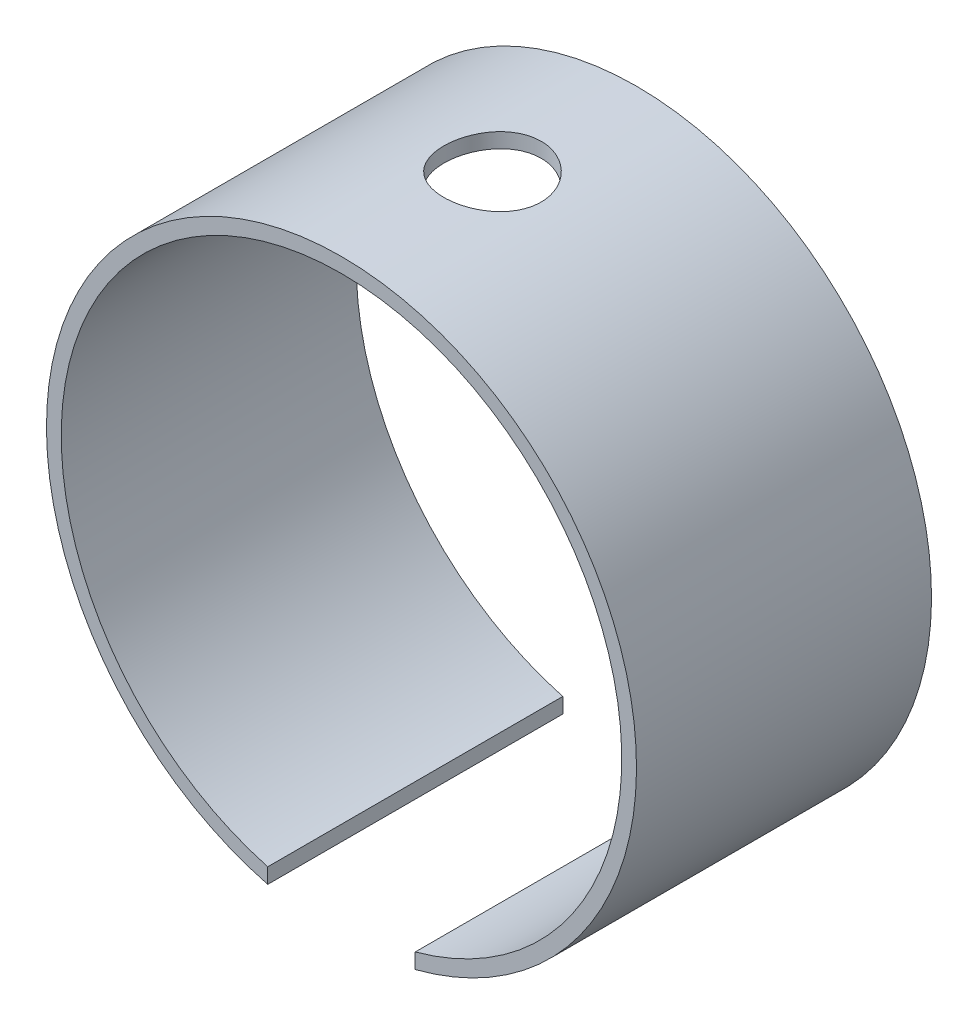
ISO-10303-21;
HEADER;
FILE_DESCRIPTION(('STEP AP214'),'2;1');
FILE_NAME('part.step','',(''),(''),'','','');
FILE_SCHEMA(('AUTOMOTIVE_DESIGN { 1 0 10303 214 1 1 1 1 }'));
ENDSEC;
DATA;
#1=APPLICATION_CONTEXT('core data for automotive mechanical design processes');
#2=APPLICATION_PROTOCOL_DEFINITION('international standard','automotive_design',2000,#1);
#3=PRODUCT_CONTEXT('',#1,'mechanical');
#4=PRODUCT('Part','Part','',(#3));
#5=PRODUCT_RELATED_PRODUCT_CATEGORY('part','',(#4));
#6=PRODUCT_DEFINITION_FORMATION('','',#4);
#7=PRODUCT_DEFINITION_CONTEXT('part definition',#1,'design');
#8=PRODUCT_DEFINITION('design','',#6,#7);
#9=PRODUCT_DEFINITION_SHAPE('','',#8);
#10=(LENGTH_UNIT() NAMED_UNIT(*) SI_UNIT(.MILLI.,.METRE.));
#11=(NAMED_UNIT(*) PLANE_ANGLE_UNIT() SI_UNIT($,.RADIAN.));
#12=(NAMED_UNIT(*) SI_UNIT($,.STERADIAN.) SOLID_ANGLE_UNIT());
#13=UNCERTAINTY_MEASURE_WITH_UNIT(LENGTH_MEASURE(1.E-05),#10,'distance_accuracy_value','');
#14=(GEOMETRIC_REPRESENTATION_CONTEXT(3) GLOBAL_UNCERTAINTY_ASSIGNED_CONTEXT((#13)) GLOBAL_UNIT_ASSIGNED_CONTEXT((#10,
#11,#12)) REPRESENTATION_CONTEXT('',''));
#15=CARTESIAN_POINT('',(0.,0.,0.));
#16=DIRECTION('',(0.,0.,1.));
#17=DIRECTION('',(1.,0.,0.));
#18=AXIS2_PLACEMENT_3D('',#15,#16,#17);
#19=CARTESIAN_POINT('',(0.,0.,10.));
#20=DIRECTION('',(0.,0.,-1.));
#21=DIRECTION('',(-1.,0.,0.));
#22=AXIS2_PLACEMENT_3D('',#19,#20,#21);
#23=CYLINDRICAL_SURFACE('',#22,10.);
#24=CARTESIAN_POINT('',(0.,10.,3.23240713275445));
#25=CARTESIAN_POINT('',(-0.0920114531057515,9.99999843258098,3.23241083373976));
#26=CARTESIAN_POINT('',(-0.184073454347173,9.9987168476551,3.24012959143987));
#27=CARTESIAN_POINT('',(-0.36561632253533,9.99372775496381,3.27078836789238));
#28=CARTESIAN_POINT('',(-0.45509472135177,9.99001800272159,3.29374246971325));
#29=CARTESIAN_POINT('',(-0.628817487751616,9.98058875631552,3.35416077169037));
#30=CARTESIAN_POINT('',(-0.713066038744486,9.974870893487,3.39161319631475));
#31=CARTESIAN_POINT('',(-0.874072236504043,9.96205444853337,3.47993438690307));
#32=CARTESIAN_POINT('',(-0.95083075765333,9.95495602786422,3.53080158425946));
#33=CARTESIAN_POINT('',(-1.09540879372213,9.9400912001718,3.64501590988737));
#34=CARTESIAN_POINT('',(-1.16314787882339,9.93231968689365,3.7084641963727));
#35=CARTESIAN_POINT('',(-1.28706950777735,9.91702374723339,3.84582190634768));
#36=CARTESIAN_POINT('',(-1.34325132909589,9.90949933632427,3.91973198339763));
#37=CARTESIAN_POINT('',(-1.44278500045253,9.89550007731641,4.07646647643113));
#38=CARTESIAN_POINT('',(-1.48605749570899,9.88903182722124,4.15934192709833));
#39=CARTESIAN_POINT('',(-1.55803674048924,9.87794796970923,4.33130975799094));
#40=CARTESIAN_POINT('',(-1.58674445381556,9.87333223970889,4.42040172640373));
#41=CARTESIAN_POINT('',(-1.6285261950301,9.86652679242373,4.60142171475544));
#42=CARTESIAN_POINT('',(-1.64173895927951,9.86431555933323,4.69331688843321));
#43=CARTESIAN_POINT('',(-1.65258585530687,9.86250435770823,4.87804449867788));
#44=CARTESIAN_POINT('',(-1.6502210677036,9.86290420804218,4.97087686978508));
#45=CARTESIAN_POINT('',(-1.63009303176278,9.86625034802632,5.15385440981116));
#46=CARTESIAN_POINT('',(-1.61248549472488,9.86917088684506,5.24401724678183));
#47=CARTESIAN_POINT('',(-1.5626160736781,9.87718903199042,5.42009120328785));
#48=CARTESIAN_POINT('',(-1.53035369619838,9.88228671162733,5.50600217954273));
#49=CARTESIAN_POINT('',(-1.45193210975571,9.89411264039674,5.67160066267887));
#50=CARTESIAN_POINT('',(-1.4057081060585,9.90084846298694,5.75125692199514));
#51=CARTESIAN_POINT('',(-1.30072141548377,9.9151864393107,5.90174145666221));
#52=CARTESIAN_POINT('',(-1.24195773629987,9.92278866158316,5.97256903266674));
#53=CARTESIAN_POINT('',(-1.11271072676603,9.93811607123993,6.10428711163713));
#54=CARTESIAN_POINT('',(-1.04209376928223,9.94584163094155,6.16504652738441));
#55=CARTESIAN_POINT('',(-0.891597059898566,9.96045987838133,6.27387315436072));
#56=CARTESIAN_POINT('',(-0.811717250503358,9.9673525609492,6.32194028680155));
#57=CARTESIAN_POINT('',(-0.644840083170754,9.97953794169528,6.40402928328877));
#58=CARTESIAN_POINT('',(-0.55783700315656,9.98482933722619,6.43803972039248));
#59=CARTESIAN_POINT('',(-0.379246930002471,9.99320544362233,6.49092904552979));
#60=CARTESIAN_POINT('',(-0.287660313260821,9.99629033536768,6.50980917389924));
#61=CARTESIAN_POINT('',(-0.103632983819161,9.99988156603306,6.53172459391562));
#62=CARTESIAN_POINT('',(-0.0112142564118353,10.0004171933872,6.53493986887599));
#63=CARTESIAN_POINT('',(0.172841505554682,9.99892971175882,6.52591393407419));
#64=CARTESIAN_POINT('',(0.264478569441164,9.99690669920295,6.51367330679398));
#65=CARTESIAN_POINT('',(0.44381495554177,9.99054737820398,6.47423272997735));
#66=CARTESIAN_POINT('',(0.531534371938302,9.98622483070291,6.4471217384461));
#67=CARTESIAN_POINT('',(0.701182959294593,9.97574921956607,6.37880474019938));
#68=CARTESIAN_POINT('',(0.78311181018899,9.96959605484327,6.33759795509277));
#69=CARTESIAN_POINT('',(0.939636398877253,9.95606928426946,6.24184581325547));
#70=CARTESIAN_POINT('',(1.01416235726447,9.94868555427358,6.18718784683735));
#71=CARTESIAN_POINT('',(1.15304841333209,9.93354765732487,6.06623998368566));
#72=CARTESIAN_POINT('',(1.21740778758216,9.92579346406182,5.99994925990016));
#73=CARTESIAN_POINT('',(1.33479962911472,9.91069407401676,5.85681102642616));
#74=CARTESIAN_POINT('',(1.38771058951944,9.90335382329475,5.77986326165564));
#75=CARTESIAN_POINT('',(1.47985547415617,9.89000528724128,5.61806608568699));
#76=CARTESIAN_POINT('',(1.51908982562647,9.88399696030451,5.53321692142254));
#77=CARTESIAN_POINT('',(1.58258535747086,9.87402953570153,5.3583676003513));
#78=CARTESIAN_POINT('',(1.60690737863649,9.87006212213643,5.26839003295778));
#79=CARTESIAN_POINT('',(1.64007952798876,9.86460473721112,5.08555582097389));
#80=CARTESIAN_POINT('',(1.64893097191819,9.86311455516768,4.99269942190629));
#81=CARTESIAN_POINT('',(1.65087457438795,9.86278931217107,4.80795649145264));
#82=CARTESIAN_POINT('',(1.64415796786954,9.86392203182987,4.71607197256234));
#83=CARTESIAN_POINT('',(1.61556925478547,9.86864441177183,4.53475938089058));
#84=CARTESIAN_POINT('',(1.59369719454886,9.87223406454433,4.44533130060086));
#85=CARTESIAN_POINT('',(1.53549112071357,9.88145370519205,4.27154189031904));
#86=CARTESIAN_POINT('',(1.49917324977366,9.88708141498759,4.18717502530348));
#87=CARTESIAN_POINT('',(1.41312606218935,9.8997453323177,4.02570086589413));
#88=CARTESIAN_POINT('',(1.36339610211421,9.90678160742252,3.94859392002672));
#89=CARTESIAN_POINT('',(1.25125259966706,9.92157214136343,3.80286163511676));
#90=CARTESIAN_POINT('',(1.18869826623127,9.92933379899765,3.73434537293488));
#91=CARTESIAN_POINT('',(1.05297867490409,9.94464125601211,3.60871653287769));
#92=CARTESIAN_POINT('',(0.979810970092672,9.95218700513286,3.55160659197421));
#93=CARTESIAN_POINT('',(0.824354696103047,9.96627143049841,3.45005971018097));
#94=CARTESIAN_POINT('',(0.742007852048188,9.97280295936929,3.40571098477642));
#95=CARTESIAN_POINT('',(0.570959586923796,9.98405342047581,3.33154377994814));
#96=CARTESIAN_POINT('',(0.482264623543764,9.98877416450827,3.30171076862921));
#97=CARTESIAN_POINT('',(0.327682758240929,9.99483601455804,3.26392779122761));
#98=CARTESIAN_POINT('',(0.2627330667111,9.99676220083327,3.25212638393995));
#99=CARTESIAN_POINT('',(0.131864227625941,9.99934474465587,3.23636479382134));
#100=CARTESIAN_POINT('',(0.065945096254669,10.0000011233775,3.23240448023866));
#101=CARTESIAN_POINT('',(0.,10.,3.23240713275445));
#102=B_SPLINE_CURVE_WITH_KNOTS('',3,(#24,#25,#26,#27,#28,#29,#30,#31,#32,#33,#34,#35,#36,#37,
#38,#39,#40,#41,#42,#43,#44,#45,#46,#47,#48,#49,#50,#51,#52,#53,#54,#55,#56,#57,#58,#59,#60,#61,
#62,#63,#64,#65,#66,#67,#68,#69,#70,#71,#72,#73,#74,#75,#76,#77,#78,#79,#80,#81,#82,#83,#84,#85,
#86,#87,#88,#89,#90,#91,#92,#93,#94,#95,#96,#97,#98,#99,#100,#101),.UNSPECIFIED.,.T.,.F.,(4,2,2,
2,2,2,2,2,2,2,2,2,2,2,2,2,2,2,2,2,2,2,2,2,2,2,2,2,2,2,2,2,2,2,2,2,2,2,4),(0.,0.275793319008919,
0.551841928312974,0.827666799870601,1.10345943314171,1.38156673144316,1.65969141110742,
1.93949209608634,2.21927426326045,2.49653175525207,2.7737700140227,3.04820914252878,
3.32265751287873,3.59839967320043,3.87416366201708,4.15327572401922,4.43238951858749,
4.71172976565334,4.99104711092802,5.26714751096619,5.54323750600191,5.81769359979006,
6.09216485190805,6.36901711215388,6.6458890636926,6.92556925596461,7.2052407106323,
7.48376340648035,7.76226241335699,8.03735855216248,8.31245385002405,8.58724259883662,
8.86204453269319,9.1400425875962,9.41810483731135,9.69804546871321,9.97770526783285,
10.1753710978728,10.3730336317699),.UNSPECIFIED.);
#103=CARTESIAN_POINT('',(0.,10.,3.23240713275445));
#104=VERTEX_POINT('',#103);
#105=EDGE_CURVE('E91',#104,#104,#102,.T.);
#106=ORIENTED_EDGE('',*,*,#105,.F.);
#107=EDGE_LOOP('',(#106));
#108=FACE_BOUND('',#107,.T.);
#109=CARTESIAN_POINT('',(0.,0.,10.));
#110=DIRECTION('',(0.,0.,1.));
#111=DIRECTION('',(1.,0.,0.));
#112=AXIS2_PLACEMENT_3D('',#109,#110,#111);
#113=CIRCLE('',#112,10.);
#114=CARTESIAN_POINT('',(2.5,-9.68245836551854,10.));
#115=VERTEX_POINT('',#114);
#116=CARTESIAN_POINT('',(-2.5,-9.68245836551854,10.));
#117=VERTEX_POINT('',#116);
#118=EDGE_CURVE('E80',#115,#117,#113,.T.);
#119=ORIENTED_EDGE('',*,*,#118,.F.);
#120=DIRECTION('',(0.,0.,-1.));
#121=VECTOR('',#120,1.);
#122=CARTESIAN_POINT('',(2.5,-9.68245836551854,10.));
#123=LINE('',#122,#121);
#124=CARTESIAN_POINT('',(2.5,-9.68245836551854,0.));
#125=VERTEX_POINT('',#124);
#126=EDGE_CURVE('E123',#115,#125,#123,.T.);
#127=ORIENTED_EDGE('',*,*,#126,.T.);
#128=CARTESIAN_POINT('',(0.,0.,0.));
#129=DIRECTION('',(0.,0.,1.));
#130=DIRECTION('',(1.,0.,0.));
#131=AXIS2_PLACEMENT_3D('',#128,#129,#130);
#132=CIRCLE('',#131,10.);
#133=CARTESIAN_POINT('',(-2.5,-9.68245836551854,0.));
#134=VERTEX_POINT('',#133);
#135=EDGE_CURVE('E93',#125,#134,#132,.T.);
#136=ORIENTED_EDGE('',*,*,#135,.T.);
#137=DIRECTION('',(0.,0.,-1.));
#138=VECTOR('',#137,1.);
#139=CARTESIAN_POINT('',(-2.5,-9.68245836551854,10.));
#140=LINE('',#139,#138);
#141=EDGE_CURVE('E57',#117,#134,#140,.T.);
#142=ORIENTED_EDGE('',*,*,#141,.F.);
#143=EDGE_LOOP('',(#119,#127,#136,#142));
#144=FACE_BOUND('',#143,.T.);
#145=ADVANCED_FACE('F35',(#108,#144),#23,.T.);
#146=CARTESIAN_POINT('',(0.,0.,10.));
#147=DIRECTION('',(0.,0.,-1.));
#148=DIRECTION('',(-1.,0.,0.));
#149=AXIS2_PLACEMENT_3D('',#146,#147,#148);
#150=CYLINDRICAL_SURFACE('',#149,9.5);
#151=DIRECTION('',(0.,0.,-1.));
#152=VECTOR('',#151,1.);
#153=CARTESIAN_POINT('',(2.5,-9.16515138991168,10.));
#154=LINE('',#153,#152);
#155=CARTESIAN_POINT('',(2.5,-9.16515138991168,10.));
#156=VERTEX_POINT('',#155);
#157=CARTESIAN_POINT('',(2.5,-9.16515138991168,0.));
#158=VERTEX_POINT('',#157);
#159=EDGE_CURVE('E50',#156,#158,#154,.T.);
#160=ORIENTED_EDGE('',*,*,#159,.F.);
#161=CARTESIAN_POINT('',(0.,0.,10.));
#162=DIRECTION('',(0.,0.,1.));
#163=DIRECTION('',(1.,0.,0.));
#164=AXIS2_PLACEMENT_3D('',#161,#162,#163);
#165=CIRCLE('',#164,9.5);
#166=CARTESIAN_POINT('',(-2.5,-9.16515138991168,10.));
#167=VERTEX_POINT('',#166);
#168=EDGE_CURVE('E88',#156,#167,#165,.T.);
#169=ORIENTED_EDGE('',*,*,#168,.T.);
#170=DIRECTION('',(0.,0.,-1.));
#171=VECTOR('',#170,1.);
#172=CARTESIAN_POINT('',(-2.5,-9.16515138991168,10.));
#173=LINE('',#172,#171);
#174=CARTESIAN_POINT('',(-2.5,-9.16515138991168,0.));
#175=VERTEX_POINT('',#174);
#176=EDGE_CURVE('E74',#167,#175,#173,.T.);
#177=ORIENTED_EDGE('',*,*,#176,.T.);
#178=CARTESIAN_POINT('',(0.,0.,0.));
#179=DIRECTION('',(0.,0.,1.));
#180=DIRECTION('',(1.,0.,0.));
#181=AXIS2_PLACEMENT_3D('',#178,#179,#180);
#182=CIRCLE('',#181,9.5);
#183=EDGE_CURVE('E86',#158,#175,#182,.T.);
#184=ORIENTED_EDGE('',*,*,#183,.F.);
#185=EDGE_LOOP('',(#160,#169,#177,#184));
#186=FACE_BOUND('',#185,.T.);
#187=CARTESIAN_POINT('',(0.,9.5,3.23240713275445));
#188=CARTESIAN_POINT('',(-0.0919399217885246,9.49999838936285,3.23241076647073));
#189=CARTESIAN_POINT('',(-0.183928577858103,9.49865146069051,3.2401175948579));
#190=CARTESIAN_POINT('',(-0.365321938017354,9.49340803554003,3.27072618957211));
#191=CARTESIAN_POINT('',(-0.454724254467508,9.48950925705691,3.29364155647074));
#192=CARTESIAN_POINT('',(-0.628294641881875,9.47959905280535,3.35395117701585));
#193=CARTESIAN_POINT('',(-0.712467070178515,9.47358941426996,3.39133318469464));
#194=CARTESIAN_POINT('',(-0.873335323962381,9.46011679357683,3.47948198503514));
#195=CARTESIAN_POINT('',(-0.950031921740333,9.45265396178051,3.53024739311304));
#196=CARTESIAN_POINT('',(-1.09457461881936,9.43701476728335,3.64428024644196));
#197=CARTESIAN_POINT('',(-1.16233216231184,9.42883243588194,3.70765913415982));
#198=CARTESIAN_POINT('',(-1.2863080330048,9.41272167202095,3.84488001419666));
#199=CARTESIAN_POINT('',(-1.34252560044387,9.40479325630749,3.91872269488337));
#200=CARTESIAN_POINT('',(-1.44218499917427,9.39003015642243,4.07538909800425));
#201=CARTESIAN_POINT('',(-1.48553843942437,9.38320318010804,4.15826983806678));
#202=CARTESIAN_POINT('',(-1.55767350294935,9.37149919249673,4.33027600973453));
#203=CARTESIAN_POINT('',(-1.58645619785255,9.36662203780267,4.41940098154893));
#204=CARTESIAN_POINT('',(-1.62835201456431,9.35942955110968,4.60042400468819));
#205=CARTESIAN_POINT('',(-1.64161854114327,9.3570891559766,4.69228553720422));
#206=CARTESIAN_POINT('',(-1.65258123886519,9.35515944845582,4.876958256122));
#207=CARTESIAN_POINT('',(-1.65027860672633,9.35556992462329,4.96976936898702));
#208=CARTESIAN_POINT('',(-1.63029312033906,9.35907271814946,5.15260634890267));
#209=CARTESIAN_POINT('',(-1.61278327308284,9.36213486723961,5.24265178943563));
#210=CARTESIAN_POINT('',(-1.56315221284933,9.37054870461573,5.41850715825131));
#211=CARTESIAN_POINT('',(-1.53103045961087,9.37590047755792,5.50431692979419));
#212=CARTESIAN_POINT('',(-1.45291402617485,9.38832280145323,5.66977925812567));
#213=CARTESIAN_POINT('',(-1.40684814984682,9.39540213618627,5.7493975158992));
#214=CARTESIAN_POINT('',(-1.30220159453448,9.41047592058677,5.89983960097231));
#215=CARTESIAN_POINT('',(-1.24361982080274,9.4184704502766,5.97066265811099));
#216=CARTESIAN_POINT('',(-1.11466495388473,9.43460604705644,6.10250479135624));
#217=CARTESIAN_POINT('',(-1.04414356896006,9.44274763685121,6.16337885236147));
#218=CARTESIAN_POINT('',(-0.893811120670815,9.4581605853403,6.27245237695349));
#219=CARTESIAN_POINT('',(-0.813999987513573,9.46543193749581,6.3206517453081));
#220=CARTESIAN_POINT('',(-0.647212408533258,9.47829679587697,6.40302350706652));
#221=CARTESIAN_POINT('',(-0.560229139913966,9.48388868041065,6.43718235461245));
#222=CARTESIAN_POINT('',(-0.381641132999912,9.49275170696562,6.49036496781659));
#223=CARTESIAN_POINT('',(-0.290036815811163,9.49602306004412,6.50939010993617));
#224=CARTESIAN_POINT('',(-0.10605617169777,9.49984785315029,6.53156696997144));
#225=CARTESIAN_POINT('',(-0.0137045099640213,9.50043535593516,6.53491763761209));
#226=CARTESIAN_POINT('',(0.170240186525353,9.49891980633322,6.52618189801762));
#227=CARTESIAN_POINT('',(0.261833252911588,9.4968168667021,6.51409613771902));
#228=CARTESIAN_POINT('',(0.4410408889574,9.49017784585653,6.47499607703158));
#229=CARTESIAN_POINT('',(0.528677753866208,9.48565793894895,6.4480809784159));
#230=CARTESIAN_POINT('',(0.698195286093258,9.47468969884991,6.38019253180017));
#231=CARTESIAN_POINT('',(0.780075607129673,9.46824124977043,6.33921833895316));
#232=CARTESIAN_POINT('',(0.936615064925791,9.45404650409261,6.24392413558546));
#233=CARTESIAN_POINT('',(1.01119799307458,9.44628843077879,6.18948072615446));
#234=CARTESIAN_POINT('',(1.15024023352615,9.43036870964452,6.06896237957714));
#235=CARTESIAN_POINT('',(1.21469874227637,9.42220702985825,6.00288652007099));
#236=CARTESIAN_POINT('',(1.33240590876892,9.40628888857156,5.8600838292611));
#237=CARTESIAN_POINT('',(1.38551969523617,9.39853804677126,5.78324510143349));
#238=CARTESIAN_POINT('',(1.47808573577417,9.3844266804326,5.6216191436659));
#239=CARTESIAN_POINT('',(1.51753844901511,9.3780661091677,5.53683218100037));
#240=CARTESIAN_POINT('',(1.5814640840202,9.36749825300357,5.36208237828204));
#241=CARTESIAN_POINT('',(1.60600241002621,9.36328157995419,5.27214405759299));
#242=CARTESIAN_POINT('',(1.63960730176126,9.35745605564557,5.08934231141472));
#243=CARTESIAN_POINT('',(1.64867534041983,9.35584695611941,4.99647916525632));
#244=CARTESIAN_POINT('',(1.65103848573468,9.35543009003453,4.81181187952636));
#245=CARTESIAN_POINT('',(1.64454601917378,9.35658459540642,4.7200104749634));
#246=CARTESIAN_POINT('',(1.61643364801077,9.36148185463803,4.53882789169918));
#247=CARTESIAN_POINT('',(1.59481380499061,9.36522459796129,4.44944670314702));
#248=CARTESIAN_POINT('',(1.53714449436314,9.37486177409024,4.27573434636771));
#249=CARTESIAN_POINT('',(1.50111485250386,9.38075324958201,4.19139642187241));
#250=CARTESIAN_POINT('',(1.41567093107219,9.39402666131478,4.02992806625315));
#251=CARTESIAN_POINT('',(1.36625589480508,9.40140868181234,3.95279804293338));
#252=CARTESIAN_POINT('',(1.25469208737073,9.41695022556423,3.80686459381867));
#253=CARTESIAN_POINT('',(1.19238756313499,9.42511853535553,3.73818115626537));
#254=CARTESIAN_POINT('',(1.05714079731291,9.44124365111701,3.61217206054328));
#255=CARTESIAN_POINT('',(0.984196109375465,9.44920040794891,3.55484902148774));
#256=CARTESIAN_POINT('',(0.829081533373803,9.46407599914757,3.45278829862443));
#257=CARTESIAN_POINT('',(0.746846011109367,9.4709865234009,3.40814913692565));
#258=CARTESIAN_POINT('',(0.575954345678588,9.48291015448451,3.33338888553765));
#259=CARTESIAN_POINT('',(0.487304578150134,9.4879251154208,3.3032536012519));
#260=CARTESIAN_POINT('',(0.331946980478703,9.49442132950602,3.26476164411638));
#261=CARTESIAN_POINT('',(0.266169324649777,9.49650194633035,3.25264854950273));
#262=CARTESIAN_POINT('',(0.133603011766719,9.49929185332884,3.23647005263256));
#263=CARTESIAN_POINT('',(0.066814374626238,9.50000117047863,3.23240449206828));
#264=CARTESIAN_POINT('',(0.,9.5,3.23240713275445));
#265=B_SPLINE_CURVE_WITH_KNOTS('',3,(#187,#188,#189,#190,#191,#192,#193,#194,#195,#196,#197,
#198,#199,#200,#201,#202,#203,#204,#205,#206,#207,#208,#209,#210,#211,#212,#213,#214,#215,#216,
#217,#218,#219,#220,#221,#222,#223,#224,#225,#226,#227,#228,#229,#230,#231,#232,#233,#234,#235,
#236,#237,#238,#239,#240,#241,#242,#243,#244,#245,#246,#247,#248,#249,#250,#251,#252,#253,#254,
#255,#256,#257,#258,#259,#260,#261,#262,#263,#264),.UNSPECIFIED.,.T.,.F.,(4,2,2,2,2,2,2,2,2,2,2,
2,2,2,2,2,2,2,2,2,2,2,2,2,2,2,2,2,2,2,2,2,2,2,2,2,2,2,4),(0.,0.2755755018224,0.551397775787433,
0.826987075948023,1.10254787611347,1.38066100361459,1.65879243547768,1.93879289820772,
2.21877276487127,2.49596048755105,2.77312690453177,3.04718080180695,3.32124483278518,
3.59673248830362,3.87224425020099,4.15146963194534,4.43069711160888,4.71019335251278,
4.98966416938648,5.26557797445753,5.54148021643523,5.81555881644023,6.08965388941541,
6.36635966138047,6.64308738377988,6.9229414576756,7.20278612432176,7.4813945598371,
7.75997646750016,8.0347769793199,8.30957637246198,8.58399897589839,8.85843709606021,
9.13640854825981,9.41444401176455,9.69458350267562,9.9744482674656,10.1747178203467,
10.3749834335689),.UNSPECIFIED.);
#266=CARTESIAN_POINT('',(0.,9.5,3.23240713275445));
#267=VERTEX_POINT('',#266);
#268=EDGE_CURVE('E96',#267,#267,#265,.T.);
#269=ORIENTED_EDGE('',*,*,#268,.T.);
#270=EDGE_LOOP('',(#269));
#271=FACE_BOUND('',#270,.T.);
#272=ADVANCED_FACE('F84',(#186,#271),#150,.F.);
#273=CARTESIAN_POINT('',(0.,0.,10.));
#274=DIRECTION('',(0.,0.,1.));
#275=DIRECTION('',(1.,0.,0.));
#276=AXIS2_PLACEMENT_3D('',#273,#274,#275);
#277=PLANE('',#276);
#278=DIRECTION('',(0.,1.,0.));
#279=VECTOR('',#278,1.);
#280=CARTESIAN_POINT('',(2.5,0.,10.));
#281=LINE('',#280,#279);
#282=EDGE_CURVE('E108',#115,#156,#281,.T.);
#283=ORIENTED_EDGE('',*,*,#282,.F.);
#284=ORIENTED_EDGE('',*,*,#118,.T.);
#285=DIRECTION('',(0.,1.,0.));
#286=VECTOR('',#285,1.);
#287=CARTESIAN_POINT('',(-2.5,0.,10.));
#288=LINE('',#287,#286);
#289=EDGE_CURVE('E127',#117,#167,#288,.T.);
#290=ORIENTED_EDGE('',*,*,#289,.T.);
#291=ORIENTED_EDGE('',*,*,#168,.F.);
#292=EDGE_LOOP('',(#283,#284,#290,#291));
#293=FACE_BOUND('',#292,.T.);
#294=ADVANCED_FACE('F131',(#293),#277,.T.);
#295=CARTESIAN_POINT('',(0.,0.,0.));
#296=DIRECTION('',(0.,0.,1.));
#297=DIRECTION('',(1.,0.,0.));
#298=AXIS2_PLACEMENT_3D('',#295,#296,#297);
#299=PLANE('',#298);
#300=ORIENTED_EDGE('',*,*,#135,.F.);
#301=DIRECTION('',(0.,1.,0.));
#302=VECTOR('',#301,1.);
#303=CARTESIAN_POINT('',(2.5,0.,0.));
#304=LINE('',#303,#302);
#305=EDGE_CURVE('E11',#125,#158,#304,.T.);
#306=ORIENTED_EDGE('',*,*,#305,.T.);
#307=ORIENTED_EDGE('',*,*,#183,.T.);
#308=DIRECTION('',(0.,1.,0.));
#309=VECTOR('',#308,1.);
#310=CARTESIAN_POINT('',(-2.5,0.,0.));
#311=LINE('',#310,#309);
#312=EDGE_CURVE('E43',#134,#175,#311,.T.);
#313=ORIENTED_EDGE('',*,*,#312,.F.);
#314=EDGE_LOOP('',(#300,#306,#307,#313));
#315=FACE_BOUND('',#314,.T.);
#316=ADVANCED_FACE('F90',(#315),#299,.F.);
#317=CARTESIAN_POINT('',(0.,10.,4.88240713275445));
#318=DIRECTION('',(0.,-1.,0.));
#319=DIRECTION('',(0.,0.,-1.));
#320=AXIS2_PLACEMENT_3D('',#317,#318,#319);
#321=CYLINDRICAL_SURFACE('',#320,1.65);
#322=ORIENTED_EDGE('',*,*,#268,.F.);
#323=EDGE_LOOP('',(#322));
#324=FACE_BOUND('',#323,.T.);
#325=ORIENTED_EDGE('',*,*,#105,.T.);
#326=EDGE_LOOP('',(#325));
#327=FACE_BOUND('',#326,.T.);
#328=ADVANCED_FACE('F111',(#324,#327),#321,.F.);
#329=CARTESIAN_POINT('',(-2.5,-10.,15.2158135184379));
#330=DIRECTION('',(1.,0.,0.));
#331=DIRECTION('',(0.,0.,-1.));
#332=AXIS2_PLACEMENT_3D('',#329,#330,#331);
#333=PLANE('',#332);
#334=ORIENTED_EDGE('',*,*,#141,.T.);
#335=ORIENTED_EDGE('',*,*,#312,.T.);
#336=ORIENTED_EDGE('',*,*,#176,.F.);
#337=ORIENTED_EDGE('',*,*,#289,.F.);
#338=EDGE_LOOP('',(#334,#335,#336,#337));
#339=FACE_BOUND('',#338,.T.);
#340=ADVANCED_FACE('F73',(#339),#333,.T.);
#341=CARTESIAN_POINT('',(2.5,-10.,15.2158135184379));
#342=DIRECTION('',(1.,0.,0.));
#343=DIRECTION('',(0.,0.,-1.));
#344=AXIS2_PLACEMENT_3D('',#341,#342,#343);
#345=PLANE('',#344);
#346=ORIENTED_EDGE('',*,*,#282,.T.);
#347=ORIENTED_EDGE('',*,*,#159,.T.);
#348=ORIENTED_EDGE('',*,*,#305,.F.);
#349=ORIENTED_EDGE('',*,*,#126,.F.);
#350=EDGE_LOOP('',(#346,#347,#348,#349));
#351=FACE_BOUND('',#350,.T.);
#352=ADVANCED_FACE('F134',(#351),#345,.F.);
#353=CLOSED_SHELL('',(#145,#272,#294,#316,#328,#340,#352));
#354=MANIFOLD_SOLID_BREP('B2',#353);
#355=ADVANCED_BREP_SHAPE_REPRESENTATION('',(#18,#354),#14);
#356=SHAPE_DEFINITION_REPRESENTATION(#9,#355);
ENDSEC;
END-ISO-10303-21;
